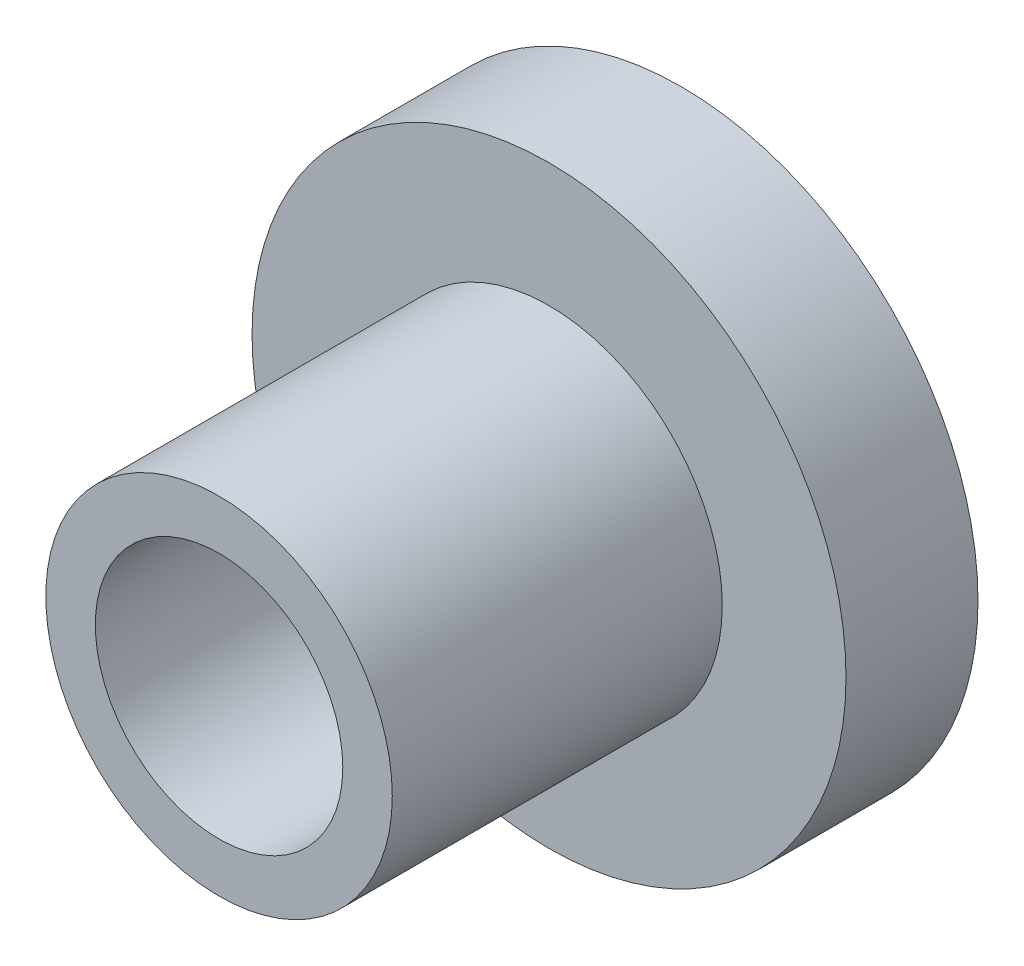
ISO-10303-21;
HEADER;
FILE_DESCRIPTION(('STEP AP214'),'2;1');
FILE_NAME('part.step','',(''),(''),'','','');
FILE_SCHEMA(('AUTOMOTIVE_DESIGN { 1 0 10303 214 1 1 1 1 }'));
ENDSEC;
DATA;
#1=APPLICATION_CONTEXT('core data for automotive mechanical design processes');
#2=APPLICATION_PROTOCOL_DEFINITION('international standard','automotive_design',2000,#1);
#3=PRODUCT_CONTEXT('',#1,'mechanical');
#4=PRODUCT('Part','Part','',(#3));
#5=PRODUCT_RELATED_PRODUCT_CATEGORY('part','',(#4));
#6=PRODUCT_DEFINITION_FORMATION('','',#4);
#7=PRODUCT_DEFINITION_CONTEXT('part definition',#1,'design');
#8=PRODUCT_DEFINITION('design','',#6,#7);
#9=PRODUCT_DEFINITION_SHAPE('','',#8);
#10=(LENGTH_UNIT() NAMED_UNIT(*) SI_UNIT(.MILLI.,.METRE.));
#11=(NAMED_UNIT(*) PLANE_ANGLE_UNIT() SI_UNIT($,.RADIAN.));
#12=(NAMED_UNIT(*) SI_UNIT($,.STERADIAN.) SOLID_ANGLE_UNIT());
#13=UNCERTAINTY_MEASURE_WITH_UNIT(LENGTH_MEASURE(1.E-05),#10,'distance_accuracy_value','');
#14=(GEOMETRIC_REPRESENTATION_CONTEXT(3) GLOBAL_UNCERTAINTY_ASSIGNED_CONTEXT((#13)) GLOBAL_UNIT_ASSIGNED_CONTEXT((#10,
#11,#12)) REPRESENTATION_CONTEXT('',''));
#15=CARTESIAN_POINT('',(0.,0.,0.));
#16=DIRECTION('',(0.,0.,1.));
#17=DIRECTION('',(1.,0.,0.));
#18=AXIS2_PLACEMENT_3D('',#15,#16,#17);
#19=CARTESIAN_POINT('',(0.,0.,2.));
#20=DIRECTION('',(0.,0.,1.));
#21=DIRECTION('',(1.,0.,0.));
#22=AXIS2_PLACEMENT_3D('',#19,#20,#21);
#23=PLANE('',#22);
#24=CARTESIAN_POINT('',(0.,0.,2.));
#25=DIRECTION('',(0.,0.,1.));
#26=DIRECTION('',(1.,0.,0.));
#27=AXIS2_PLACEMENT_3D('',#24,#25,#26);
#28=CIRCLE('',#27,4.5);
#29=CARTESIAN_POINT('',(4.5,0.,2.));
#30=VERTEX_POINT('',#29);
#31=EDGE_CURVE('E10',#30,#30,#28,.T.);
#32=ORIENTED_EDGE('',*,*,#31,.T.);
#33=EDGE_LOOP('',(#32));
#34=FACE_BOUND('',#33,.T.);
#35=CARTESIAN_POINT('',(0.,0.,2.));
#36=DIRECTION('',(0.,0.,1.));
#37=DIRECTION('',(1.,0.,0.));
#38=AXIS2_PLACEMENT_3D('',#35,#36,#37);
#39=CIRCLE('',#38,2.625);
#40=CARTESIAN_POINT('',(2.625,0.,2.));
#41=VERTEX_POINT('',#40);
#42=EDGE_CURVE('E61',#41,#41,#39,.T.);
#43=ORIENTED_EDGE('',*,*,#42,.F.);
#44=EDGE_LOOP('',(#43));
#45=FACE_BOUND('',#44,.T.);
#46=ADVANCED_FACE('F42',(#34,#45),#23,.T.);
#47=CARTESIAN_POINT('',(0.,0.,0.));
#48=DIRECTION('',(0.,0.,1.));
#49=DIRECTION('',(1.,0.,0.));
#50=AXIS2_PLACEMENT_3D('',#47,#48,#49);
#51=PLANE('',#50);
#52=CARTESIAN_POINT('',(0.,0.,0.));
#53=DIRECTION('',(0.,0.,1.));
#54=DIRECTION('',(1.,0.,0.));
#55=AXIS2_PLACEMENT_3D('',#52,#53,#54);
#56=CIRCLE('',#55,4.5);
#57=CARTESIAN_POINT('',(4.5,0.,0.));
#58=VERTEX_POINT('',#57);
#59=EDGE_CURVE('E46',#58,#58,#56,.T.);
#60=ORIENTED_EDGE('',*,*,#59,.F.);
#61=EDGE_LOOP('',(#60));
#62=FACE_BOUND('',#61,.T.);
#63=CARTESIAN_POINT('',(0.,0.,0.));
#64=DIRECTION('',(0.,0.,1.));
#65=DIRECTION('',(1.,0.,0.));
#66=AXIS2_PLACEMENT_3D('',#63,#64,#65);
#67=CIRCLE('',#66,1.875);
#68=CARTESIAN_POINT('',(1.875,0.,0.));
#69=VERTEX_POINT('',#68);
#70=EDGE_CURVE('E55',#69,#69,#67,.T.);
#71=ORIENTED_EDGE('',*,*,#70,.T.);
#72=EDGE_LOOP('',(#71));
#73=FACE_BOUND('',#72,.T.);
#74=ADVANCED_FACE('F89',(#62,#73),#51,.F.);
#75=CARTESIAN_POINT('',(0.,0.,2.));
#76=DIRECTION('',(0.,0.,-1.));
#77=DIRECTION('',(-1.,0.,0.));
#78=AXIS2_PLACEMENT_3D('',#75,#76,#77);
#79=CYLINDRICAL_SURFACE('',#78,4.5);
#80=ORIENTED_EDGE('',*,*,#31,.F.);
#81=EDGE_LOOP('',(#80));
#82=FACE_BOUND('',#81,.T.);
#83=ORIENTED_EDGE('',*,*,#59,.T.);
#84=EDGE_LOOP('',(#83));
#85=FACE_BOUND('',#84,.T.);
#86=ADVANCED_FACE('F44',(#82,#85),#79,.T.);
#87=CARTESIAN_POINT('',(0.,0.,2.));
#88=DIRECTION('',(0.,0.,-1.));
#89=DIRECTION('',(-1.,0.,0.));
#90=AXIS2_PLACEMENT_3D('',#87,#88,#89);
#91=CYLINDRICAL_SURFACE('',#90,1.875);
#92=ORIENTED_EDGE('',*,*,#70,.F.);
#93=EDGE_LOOP('',(#92));
#94=FACE_BOUND('',#93,.T.);
#95=CARTESIAN_POINT('',(0.,0.,7.));
#96=DIRECTION('',(0.,0.,1.));
#97=DIRECTION('',(1.,0.,0.));
#98=AXIS2_PLACEMENT_3D('',#95,#96,#97);
#99=CIRCLE('',#98,1.875);
#100=CARTESIAN_POINT('',(1.875,0.,7.));
#101=VERTEX_POINT('',#100);
#102=EDGE_CURVE('E65',#101,#101,#99,.T.);
#103=ORIENTED_EDGE('',*,*,#102,.T.);
#104=EDGE_LOOP('',(#103));
#105=FACE_BOUND('',#104,.T.);
#106=ADVANCED_FACE('F73',(#94,#105),#91,.F.);
#107=CARTESIAN_POINT('',(0.,0.,7.));
#108=DIRECTION('',(0.,0.,1.));
#109=DIRECTION('',(1.,0.,0.));
#110=AXIS2_PLACEMENT_3D('',#107,#108,#109);
#111=PLANE('',#110);
#112=CARTESIAN_POINT('',(0.,0.,7.));
#113=DIRECTION('',(0.,0.,1.));
#114=DIRECTION('',(1.,0.,0.));
#115=AXIS2_PLACEMENT_3D('',#112,#113,#114);
#116=CIRCLE('',#115,2.625);
#117=CARTESIAN_POINT('',(2.625,0.,7.));
#118=VERTEX_POINT('',#117);
#119=EDGE_CURVE('E60',#118,#118,#116,.T.);
#120=ORIENTED_EDGE('',*,*,#119,.T.);
#121=EDGE_LOOP('',(#120));
#122=FACE_BOUND('',#121,.T.);
#123=ORIENTED_EDGE('',*,*,#102,.F.);
#124=EDGE_LOOP('',(#123));
#125=FACE_BOUND('',#124,.T.);
#126=ADVANCED_FACE('F75',(#122,#125),#111,.T.);
#127=CARTESIAN_POINT('',(0.,0.,7.));
#128=DIRECTION('',(0.,0.,-1.));
#129=DIRECTION('',(-1.,0.,0.));
#130=AXIS2_PLACEMENT_3D('',#127,#128,#129);
#131=CYLINDRICAL_SURFACE('',#130,2.625);
#132=ORIENTED_EDGE('',*,*,#119,.F.);
#133=EDGE_LOOP('',(#132));
#134=FACE_BOUND('',#133,.T.);
#135=ORIENTED_EDGE('',*,*,#42,.T.);
#136=EDGE_LOOP('',(#135));
#137=FACE_BOUND('',#136,.T.);
#138=ADVANCED_FACE('F77',(#134,#137),#131,.T.);
#139=CLOSED_SHELL('',(#46,#74,#86,#106,#126,#138));
#140=MANIFOLD_SOLID_BREP('B2',#139);
#141=ADVANCED_BREP_SHAPE_REPRESENTATION('',(#18,#140),#14);
#142=SHAPE_DEFINITION_REPRESENTATION(#9,#141);
ENDSEC;
END-ISO-10303-21;
